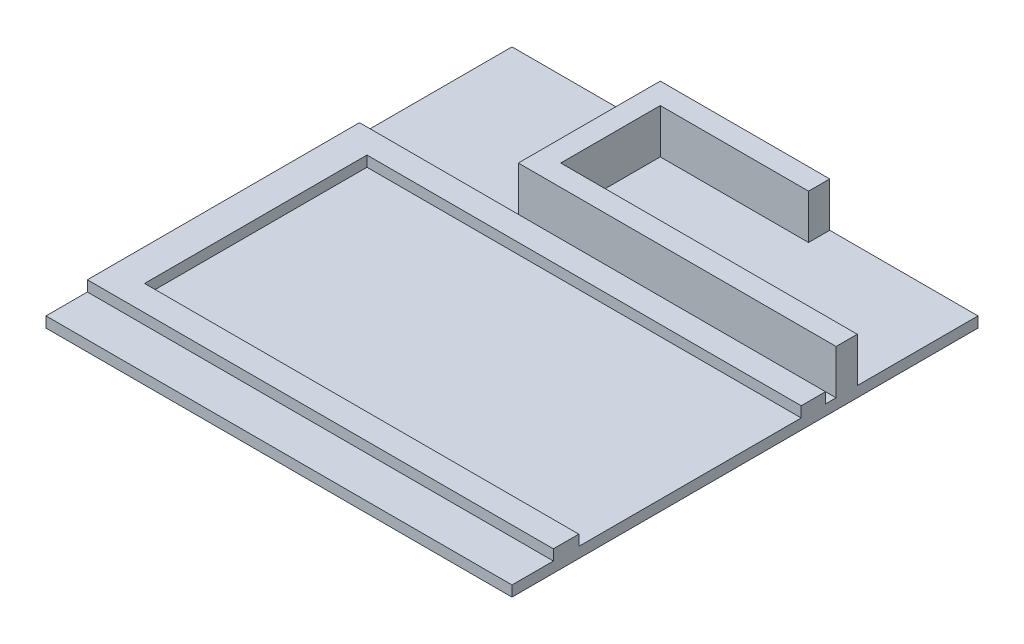
ISO-10303-21;
HEADER;
FILE_DESCRIPTION(('STEP AP214'),'2;1');
FILE_NAME('part.step','',(''),(''),'','','');
FILE_SCHEMA(('AUTOMOTIVE_DESIGN { 1 0 10303 214 1 1 1 1 }'));
ENDSEC;
DATA;
#1=APPLICATION_CONTEXT('core data for automotive mechanical design processes');
#2=APPLICATION_PROTOCOL_DEFINITION('international standard','automotive_design',2000,#1);
#3=PRODUCT_CONTEXT('',#1,'mechanical');
#4=PRODUCT('Part','Part','',(#3));
#5=PRODUCT_RELATED_PRODUCT_CATEGORY('part','',(#4));
#6=PRODUCT_DEFINITION_FORMATION('','',#4);
#7=PRODUCT_DEFINITION_CONTEXT('part definition',#1,'design');
#8=PRODUCT_DEFINITION('design','',#6,#7);
#9=PRODUCT_DEFINITION_SHAPE('','',#8);
#10=(LENGTH_UNIT() NAMED_UNIT(*) SI_UNIT(.MILLI.,.METRE.));
#11=(NAMED_UNIT(*) PLANE_ANGLE_UNIT() SI_UNIT($,.RADIAN.));
#12=(NAMED_UNIT(*) SI_UNIT($,.STERADIAN.) SOLID_ANGLE_UNIT());
#13=UNCERTAINTY_MEASURE_WITH_UNIT(LENGTH_MEASURE(1.E-05),#10,'distance_accuracy_value','');
#14=(GEOMETRIC_REPRESENTATION_CONTEXT(3) GLOBAL_UNCERTAINTY_ASSIGNED_CONTEXT((#13)) GLOBAL_UNIT_ASSIGNED_CONTEXT((#10,
#11,#12)) REPRESENTATION_CONTEXT('',''));
#15=CARTESIAN_POINT('',(0.,0.,0.));
#16=DIRECTION('',(0.,0.,1.));
#17=DIRECTION('',(1.,0.,0.));
#18=AXIS2_PLACEMENT_3D('',#15,#16,#17);
#19=CARTESIAN_POINT('',(0.,5.,0.));
#20=DIRECTION('',(0.,-1.,0.));
#21=DIRECTION('',(0.,0.,-1.));
#22=AXIS2_PLACEMENT_3D('',#19,#20,#21);
#23=PLANE('',#22);
#24=DIRECTION('',(1.,0.,0.));
#25=VECTOR('',#24,1.);
#26=CARTESIAN_POINT('',(110.,5.,90.4674962115625));
#27=LINE('',#26,#25);
#28=CARTESIAN_POINT('',(-110.,5.,90.4674962115625));
#29=VERTEX_POINT('',#28);
#30=CARTESIAN_POINT('',(110.,5.,90.4674962115625));
#31=VERTEX_POINT('',#30);
#32=EDGE_CURVE('E346',#29,#31,#27,.T.);
#33=ORIENTED_EDGE('',*,*,#32,.F.);
#34=DIRECTION('',(0.,0.,1.));
#35=VECTOR('',#34,1.);
#36=CARTESIAN_POINT('',(-110.,5.,110.));
#37=LINE('',#36,#35);
#38=CARTESIAN_POINT('',(-110.,5.,110.));
#39=VERTEX_POINT('',#38);
#40=EDGE_CURVE('E201',#29,#39,#37,.T.);
#41=ORIENTED_EDGE('',*,*,#40,.T.);
#42=DIRECTION('',(1.,0.,0.));
#43=VECTOR('',#42,1.);
#44=CARTESIAN_POINT('',(-110.,5.,110.));
#45=LINE('',#44,#43);
#46=CARTESIAN_POINT('',(110.,5.,110.));
#47=VERTEX_POINT('',#46);
#48=EDGE_CURVE('E305',#39,#47,#45,.T.);
#49=ORIENTED_EDGE('',*,*,#48,.T.);
#50=DIRECTION('',(0.,0.,-1.));
#51=VECTOR('',#50,1.);
#52=CARTESIAN_POINT('',(110.,5.,110.));
#53=LINE('',#52,#51);
#54=EDGE_CURVE('E292',#47,#31,#53,.T.);
#55=ORIENTED_EDGE('',*,*,#54,.T.);
#56=EDGE_LOOP('',(#33,#41,#49,#55));
#57=FACE_BOUND('',#56,.T.);
#58=ADVANCED_FACE('F39',(#57),#23,.F.);
#59=DIRECTION('',(-1.,0.,0.));
#60=VECTOR('',#59,1.);
#61=CARTESIAN_POINT('',(-94.9999999999999,5.,78.4674962115625));
#62=LINE('',#61,#60);
#63=CARTESIAN_POINT('',(110.,5.,78.4674962115625));
#64=VERTEX_POINT('',#63);
#65=CARTESIAN_POINT('',(-94.9999999999999,5.,78.4674962115625));
#66=VERTEX_POINT('',#65);
#67=EDGE_CURVE('E348',#64,#66,#62,.T.);
#68=ORIENTED_EDGE('',*,*,#67,.F.);
#69=CARTESIAN_POINT('',(110.,5.,-26.5325037884376));
#70=VERTEX_POINT('',#69);
#71=EDGE_CURVE('E296',#64,#70,#53,.T.);
#72=ORIENTED_EDGE('',*,*,#71,.T.);
#73=DIRECTION('',(1.,0.,0.));
#74=VECTOR('',#73,1.);
#75=CARTESIAN_POINT('',(110.,5.,-26.5325037884376));
#76=LINE('',#75,#74);
#77=CARTESIAN_POINT('',(-95.,5.,-26.5325037884375));
#78=VERTEX_POINT('',#77);
#79=EDGE_CURVE('E60',#78,#70,#76,.T.);
#80=ORIENTED_EDGE('',*,*,#79,.F.);
#81=DIRECTION('',(0.,0.,-1.));
#82=VECTOR('',#81,1.);
#83=CARTESIAN_POINT('',(-95.,5.,-26.5325037884375));
#84=LINE('',#83,#82);
#85=EDGE_CURVE('E55',#66,#78,#84,.T.);
#86=ORIENTED_EDGE('',*,*,#85,.F.);
#87=EDGE_LOOP('',(#68,#72,#80,#86));
#88=FACE_BOUND('',#87,.T.);
#89=ADVANCED_FACE('F461',(#88),#23,.F.);
#90=DIRECTION('',(-1.,0.,0.));
#91=VECTOR('',#90,1.);
#92=CARTESIAN_POINT('',(-110.,5.,-38.));
#93=LINE('',#92,#91);
#94=CARTESIAN_POINT('',(110.,5.,-38.));
#95=VERTEX_POINT('',#94);
#96=CARTESIAN_POINT('',(-110.,5.,-38.));
#97=VERTEX_POINT('',#96);
#98=EDGE_CURVE('E197',#95,#97,#93,.T.);
#99=ORIENTED_EDGE('',*,*,#98,.F.);
#100=CARTESIAN_POINT('',(110.,5.,-43.));
#101=VERTEX_POINT('',#100);
#102=EDGE_CURVE('E297',#95,#101,#53,.T.);
#103=ORIENTED_EDGE('',*,*,#102,.T.);
#104=DIRECTION('',(1.,0.,0.));
#105=VECTOR('',#104,1.);
#106=CARTESIAN_POINT('',(110.,5.,-43.));
#107=LINE('',#106,#105);
#108=CARTESIAN_POINT('',(-40.,5.,-43.));
#109=VERTEX_POINT('',#108);
#110=EDGE_CURVE('E209',#109,#101,#107,.T.);
#111=ORIENTED_EDGE('',*,*,#110,.F.);
#112=DIRECTION('',(0.,0.,1.));
#113=VECTOR('',#112,1.);
#114=CARTESIAN_POINT('',(-40.,5.,-43.));
#115=LINE('',#114,#113);
#116=CARTESIAN_POINT('',(-40.,5.,-110.));
#117=VERTEX_POINT('',#116);
#118=EDGE_CURVE('E204',#117,#109,#115,.T.);
#119=ORIENTED_EDGE('',*,*,#118,.F.);
#120=DIRECTION('',(-1.,0.,0.));
#121=VECTOR('',#120,1.);
#122=CARTESIAN_POINT('',(-110.,5.,-110.));
#123=LINE('',#122,#121);
#124=CARTESIAN_POINT('',(-110.,5.,-110.));
#125=VERTEX_POINT('',#124);
#126=EDGE_CURVE('E295',#117,#125,#123,.T.);
#127=ORIENTED_EDGE('',*,*,#126,.T.);
#128=EDGE_CURVE('E302',#125,#97,#37,.T.);
#129=ORIENTED_EDGE('',*,*,#128,.T.);
#130=EDGE_LOOP('',(#99,#103,#111,#119,#127,#129));
#131=FACE_BOUND('',#130,.T.);
#132=ADVANCED_FACE('F428',(#131),#23,.F.);
#133=DIRECTION('',(0.,0.,-1.));
#134=VECTOR('',#133,1.);
#135=CARTESIAN_POINT('',(40.,5.,-110.));
#136=LINE('',#135,#134);
#137=CARTESIAN_POINT('',(40.,5.,-100.));
#138=VERTEX_POINT('',#137);
#139=CARTESIAN_POINT('',(40.,5.,-110.));
#140=VERTEX_POINT('',#139);
#141=EDGE_CURVE('E220',#138,#140,#136,.T.);
#142=ORIENTED_EDGE('',*,*,#141,.F.);
#143=DIRECTION('',(1.,0.,0.));
#144=VECTOR('',#143,1.);
#145=CARTESIAN_POINT('',(40.,5.,-100.));
#146=LINE('',#145,#144);
#147=CARTESIAN_POINT('',(-30.,5.,-100.));
#148=VERTEX_POINT('',#147);
#149=EDGE_CURVE('E253',#148,#138,#146,.T.);
#150=ORIENTED_EDGE('',*,*,#149,.F.);
#151=DIRECTION('',(0.,0.,-1.));
#152=VECTOR('',#151,1.);
#153=CARTESIAN_POINT('',(-30.,5.,-100.));
#154=LINE('',#153,#152);
#155=CARTESIAN_POINT('',(-30.,5.,-53.));
#156=VERTEX_POINT('',#155);
#157=EDGE_CURVE('E249',#156,#148,#154,.T.);
#158=ORIENTED_EDGE('',*,*,#157,.F.);
#159=DIRECTION('',(-1.,0.,0.));
#160=VECTOR('',#159,1.);
#161=CARTESIAN_POINT('',(-30.,5.,-53.));
#162=LINE('',#161,#160);
#163=CARTESIAN_POINT('',(110.,5.,-53.));
#164=VERTEX_POINT('',#163);
#165=EDGE_CURVE('E245',#164,#156,#162,.T.);
#166=ORIENTED_EDGE('',*,*,#165,.F.);
#167=CARTESIAN_POINT('',(110.,5.,-110.));
#168=VERTEX_POINT('',#167);
#169=EDGE_CURVE('E298',#164,#168,#53,.T.);
#170=ORIENTED_EDGE('',*,*,#169,.T.);
#171=EDGE_CURVE('E299',#168,#140,#123,.T.);
#172=ORIENTED_EDGE('',*,*,#171,.T.);
#173=EDGE_LOOP('',(#142,#150,#158,#166,#170,#172));
#174=FACE_BOUND('',#173,.T.);
#175=ADVANCED_FACE('F397',(#174),#23,.F.);
#176=CARTESIAN_POINT('',(110.,5.,110.));
#177=DIRECTION('',(-1.,0.,0.));
#178=DIRECTION('',(0.,0.,1.));
#179=AXIS2_PLACEMENT_3D('',#176,#177,#178);
#180=PLANE('',#179);
#181=DIRECTION('',(0.,0.,-1.));
#182=VECTOR('',#181,1.);
#183=CARTESIAN_POINT('',(110.,0.,110.));
#184=LINE('',#183,#182);
#185=CARTESIAN_POINT('',(110.,0.,110.));
#186=VERTEX_POINT('',#185);
#187=CARTESIAN_POINT('',(110.,0.,-110.));
#188=VERTEX_POINT('',#187);
#189=EDGE_CURVE('E291',#186,#188,#184,.T.);
#190=ORIENTED_EDGE('',*,*,#189,.T.);
#191=DIRECTION('',(0.,-1.,0.));
#192=VECTOR('',#191,1.);
#193=CARTESIAN_POINT('',(110.,5.,-110.));
#194=LINE('',#193,#192);
#195=EDGE_CURVE('E11',#168,#188,#194,.T.);
#196=ORIENTED_EDGE('',*,*,#195,.F.);
#197=ORIENTED_EDGE('',*,*,#169,.F.);
#198=DIRECTION('',(0.,-1.,0.));
#199=VECTOR('',#198,1.);
#200=CARTESIAN_POINT('',(110.,26.,-53.));
#201=LINE('',#200,#199);
#202=CARTESIAN_POINT('',(110.,26.,-53.));
#203=VERTEX_POINT('',#202);
#204=EDGE_CURVE('E279',#203,#164,#201,.T.);
#205=ORIENTED_EDGE('',*,*,#204,.F.);
#206=DIRECTION('',(0.,0.,-1.));
#207=VECTOR('',#206,1.);
#208=CARTESIAN_POINT('',(110.,26.,-53.));
#209=LINE('',#208,#207);
#210=CARTESIAN_POINT('',(110.,26.,-43.));
#211=VERTEX_POINT('',#210);
#212=EDGE_CURVE('E223',#211,#203,#209,.T.);
#213=ORIENTED_EDGE('',*,*,#212,.F.);
#214=DIRECTION('',(0.,-1.,0.));
#215=VECTOR('',#214,1.);
#216=CARTESIAN_POINT('',(110.,26.,-43.));
#217=LINE('',#216,#215);
#218=EDGE_CURVE('E283',#211,#101,#217,.T.);
#219=ORIENTED_EDGE('',*,*,#218,.T.);
#220=ORIENTED_EDGE('',*,*,#102,.F.);
#221=DIRECTION('',(0.,-1.,0.));
#222=VECTOR('',#221,1.);
#223=CARTESIAN_POINT('',(110.,10.,-38.));
#224=LINE('',#223,#222);
#225=CARTESIAN_POINT('',(110.,10.,-38.));
#226=VERTEX_POINT('',#225);
#227=EDGE_CURVE('E365',#226,#95,#224,.T.);
#228=ORIENTED_EDGE('',*,*,#227,.F.);
#229=DIRECTION('',(0.,0.,-1.));
#230=VECTOR('',#229,1.);
#231=CARTESIAN_POINT('',(110.,10.,-38.));
#232=LINE('',#231,#230);
#233=CARTESIAN_POINT('',(110.,10.,-26.5325037884376));
#234=VERTEX_POINT('',#233);
#235=EDGE_CURVE('E433',#234,#226,#232,.T.);
#236=ORIENTED_EDGE('',*,*,#235,.F.);
#237=DIRECTION('',(0.,-1.,0.));
#238=VECTOR('',#237,1.);
#239=CARTESIAN_POINT('',(110.,10.,-26.5325037884376));
#240=LINE('',#239,#238);
#241=EDGE_CURVE('E369',#234,#70,#240,.T.);
#242=ORIENTED_EDGE('',*,*,#241,.T.);
#243=ORIENTED_EDGE('',*,*,#71,.F.);
#244=DIRECTION('',(0.,-1.,0.));
#245=VECTOR('',#244,1.);
#246=CARTESIAN_POINT('',(110.,10.,78.4674962115625));
#247=LINE('',#246,#245);
#248=CARTESIAN_POINT('',(110.,10.,78.4674962115625));
#249=VERTEX_POINT('',#248);
#250=EDGE_CURVE('E211',#249,#64,#247,.T.);
#251=ORIENTED_EDGE('',*,*,#250,.F.);
#252=DIRECTION('',(0.,0.,-1.));
#253=VECTOR('',#252,1.);
#254=CARTESIAN_POINT('',(110.,10.,78.4674962115625));
#255=LINE('',#254,#253);
#256=CARTESIAN_POINT('',(110.,10.,90.4674962115625));
#257=VERTEX_POINT('',#256);
#258=EDGE_CURVE('E186',#257,#249,#255,.T.);
#259=ORIENTED_EDGE('',*,*,#258,.F.);
#260=DIRECTION('',(0.,-1.,0.));
#261=VECTOR('',#260,1.);
#262=CARTESIAN_POINT('',(110.,10.,90.4674962115625));
#263=LINE('',#262,#261);
#264=EDGE_CURVE('E182',#257,#31,#263,.T.);
#265=ORIENTED_EDGE('',*,*,#264,.T.);
#266=ORIENTED_EDGE('',*,*,#54,.F.);
#267=DIRECTION('',(0.,-1.,0.));
#268=VECTOR('',#267,1.);
#269=CARTESIAN_POINT('',(110.,5.,110.));
#270=LINE('',#269,#268);
#271=EDGE_CURVE('E308',#47,#186,#270,.T.);
#272=ORIENTED_EDGE('',*,*,#271,.T.);
#273=EDGE_LOOP('',(#190,#196,#197,#205,#213,#219,#220,#228,#236,#242,#243,#251,#259,#265,#266,#272));
#274=FACE_BOUND('',#273,.T.);
#275=ADVANCED_FACE('F41',(#274),#180,.F.);
#276=CARTESIAN_POINT('',(-110.,5.,-110.));
#277=DIRECTION('',(0.,0.,1.));
#278=DIRECTION('',(1.,0.,0.));
#279=AXIS2_PLACEMENT_3D('',#276,#277,#278);
#280=PLANE('',#279);
#281=DIRECTION('',(-1.,0.,0.));
#282=VECTOR('',#281,1.);
#283=CARTESIAN_POINT('',(-110.,0.,-110.));
#284=LINE('',#283,#282);
#285=CARTESIAN_POINT('',(-110.,0.,-110.));
#286=VERTEX_POINT('',#285);
#287=EDGE_CURVE('E312',#188,#286,#284,.T.);
#288=ORIENTED_EDGE('',*,*,#287,.T.);
#289=DIRECTION('',(0.,-1.,0.));
#290=VECTOR('',#289,1.);
#291=CARTESIAN_POINT('',(-110.,5.,-110.));
#292=LINE('',#291,#290);
#293=EDGE_CURVE('E48',#125,#286,#292,.T.);
#294=ORIENTED_EDGE('',*,*,#293,.F.);
#295=ORIENTED_EDGE('',*,*,#126,.F.);
#296=DIRECTION('',(0.,-1.,0.));
#297=VECTOR('',#296,1.);
#298=CARTESIAN_POINT('',(-40.,26.,-110.));
#299=LINE('',#298,#297);
#300=CARTESIAN_POINT('',(-40.,26.,-110.));
#301=VERTEX_POINT('',#300);
#302=EDGE_CURVE('E240',#301,#117,#299,.T.);
#303=ORIENTED_EDGE('',*,*,#302,.F.);
#304=DIRECTION('',(-1.,0.,0.));
#305=VECTOR('',#304,1.);
#306=CARTESIAN_POINT('',(-40.,26.,-110.));
#307=LINE('',#306,#305);
#308=CARTESIAN_POINT('',(40.,26.,-110.));
#309=VERTEX_POINT('',#308);
#310=EDGE_CURVE('E238',#309,#301,#307,.T.);
#311=ORIENTED_EDGE('',*,*,#310,.F.);
#312=DIRECTION('',(0.,-1.,0.));
#313=VECTOR('',#312,1.);
#314=CARTESIAN_POINT('',(40.,26.,-110.));
#315=LINE('',#314,#313);
#316=EDGE_CURVE('E263',#309,#140,#315,.T.);
#317=ORIENTED_EDGE('',*,*,#316,.T.);
#318=ORIENTED_EDGE('',*,*,#171,.F.);
#319=ORIENTED_EDGE('',*,*,#195,.T.);
#320=EDGE_LOOP('',(#288,#294,#295,#303,#311,#317,#318,#319));
#321=FACE_BOUND('',#320,.T.);
#322=ADVANCED_FACE('F399',(#321),#280,.F.);
#323=CARTESIAN_POINT('',(-110.,5.,110.));
#324=DIRECTION('',(1.,0.,0.));
#325=DIRECTION('',(0.,0.,-1.));
#326=AXIS2_PLACEMENT_3D('',#323,#324,#325);
#327=PLANE('',#326);
#328=DIRECTION('',(0.,0.,1.));
#329=VECTOR('',#328,1.);
#330=CARTESIAN_POINT('',(-110.,0.,110.));
#331=LINE('',#330,#329);
#332=CARTESIAN_POINT('',(-110.,0.,110.));
#333=VERTEX_POINT('',#332);
#334=EDGE_CURVE('E315',#286,#333,#331,.T.);
#335=ORIENTED_EDGE('',*,*,#334,.T.);
#336=DIRECTION('',(0.,-1.,0.));
#337=VECTOR('',#336,1.);
#338=CARTESIAN_POINT('',(-110.,5.,110.));
#339=LINE('',#338,#337);
#340=EDGE_CURVE('E324',#39,#333,#339,.T.);
#341=ORIENTED_EDGE('',*,*,#340,.F.);
#342=ORIENTED_EDGE('',*,*,#40,.F.);
#343=DIRECTION('',(0.,-1.,0.));
#344=VECTOR('',#343,1.);
#345=CARTESIAN_POINT('',(-110.,10.,90.4674962115625));
#346=LINE('',#345,#344);
#347=CARTESIAN_POINT('',(-110.,10.,90.4674962115625));
#348=VERTEX_POINT('',#347);
#349=EDGE_CURVE('E180',#348,#29,#346,.T.);
#350=ORIENTED_EDGE('',*,*,#349,.F.);
#351=DIRECTION('',(0.,0.,1.));
#352=VECTOR('',#351,1.);
#353=CARTESIAN_POINT('',(-110.,10.,90.4674962115625));
#354=LINE('',#353,#352);
#355=CARTESIAN_POINT('',(-110.,10.,-38.));
#356=VERTEX_POINT('',#355);
#357=EDGE_CURVE('E187',#356,#348,#354,.T.);
#358=ORIENTED_EDGE('',*,*,#357,.F.);
#359=DIRECTION('',(0.,-1.,0.));
#360=VECTOR('',#359,1.);
#361=CARTESIAN_POINT('',(-110.,10.,-38.));
#362=LINE('',#361,#360);
#363=EDGE_CURVE('E362',#356,#97,#362,.T.);
#364=ORIENTED_EDGE('',*,*,#363,.T.);
#365=ORIENTED_EDGE('',*,*,#128,.F.);
#366=ORIENTED_EDGE('',*,*,#293,.T.);
#367=EDGE_LOOP('',(#335,#341,#342,#350,#358,#364,#365,#366));
#368=FACE_BOUND('',#367,.T.);
#369=ADVANCED_FACE('F199',(#368),#327,.F.);
#370=CARTESIAN_POINT('',(-110.,5.,110.));
#371=DIRECTION('',(0.,0.,-1.));
#372=DIRECTION('',(-1.,0.,0.));
#373=AXIS2_PLACEMENT_3D('',#370,#371,#372);
#374=PLANE('',#373);
#375=DIRECTION('',(1.,0.,0.));
#376=VECTOR('',#375,1.);
#377=CARTESIAN_POINT('',(-110.,0.,110.));
#378=LINE('',#377,#376);
#379=EDGE_CURVE('E318',#333,#186,#378,.T.);
#380=ORIENTED_EDGE('',*,*,#379,.T.);
#381=ORIENTED_EDGE('',*,*,#271,.F.);
#382=ORIENTED_EDGE('',*,*,#48,.F.);
#383=ORIENTED_EDGE('',*,*,#340,.T.);
#384=EDGE_LOOP('',(#380,#381,#382,#383));
#385=FACE_BOUND('',#384,.T.);
#386=ADVANCED_FACE('F340',(#385),#374,.F.);
#387=CARTESIAN_POINT('',(0.,0.,0.));
#388=DIRECTION('',(0.,-1.,0.));
#389=DIRECTION('',(0.,0.,-1.));
#390=AXIS2_PLACEMENT_3D('',#387,#388,#389);
#391=PLANE('',#390);
#392=ORIENTED_EDGE('',*,*,#189,.F.);
#393=ORIENTED_EDGE('',*,*,#379,.F.);
#394=ORIENTED_EDGE('',*,*,#334,.F.);
#395=ORIENTED_EDGE('',*,*,#287,.F.);
#396=EDGE_LOOP('',(#392,#393,#394,#395));
#397=FACE_BOUND('',#396,.T.);
#398=ADVANCED_FACE('F337',(#397),#391,.T.);
#399=CARTESIAN_POINT('',(-40.,26.,-43.));
#400=DIRECTION('',(1.,0.,0.));
#401=DIRECTION('',(0.,0.,-1.));
#402=AXIS2_PLACEMENT_3D('',#399,#400,#401);
#403=PLANE('',#402);
#404=ORIENTED_EDGE('',*,*,#118,.T.);
#405=DIRECTION('',(0.,-1.,0.));
#406=VECTOR('',#405,1.);
#407=CARTESIAN_POINT('',(-40.,26.,-43.));
#408=LINE('',#407,#406);
#409=CARTESIAN_POINT('',(-40.,26.,-43.));
#410=VERTEX_POINT('',#409);
#411=EDGE_CURVE('E287',#410,#109,#408,.T.);
#412=ORIENTED_EDGE('',*,*,#411,.F.);
#413=DIRECTION('',(0.,0.,1.));
#414=VECTOR('',#413,1.);
#415=CARTESIAN_POINT('',(-40.,26.,-43.));
#416=LINE('',#415,#414);
#417=EDGE_CURVE('E215',#301,#410,#416,.T.);
#418=ORIENTED_EDGE('',*,*,#417,.F.);
#419=ORIENTED_EDGE('',*,*,#302,.T.);
#420=EDGE_LOOP('',(#404,#412,#418,#419));
#421=FACE_BOUND('',#420,.T.);
#422=ADVANCED_FACE('F535',(#421),#403,.F.);
#423=CARTESIAN_POINT('',(110.,26.,-43.));
#424=DIRECTION('',(0.,0.,-1.));
#425=DIRECTION('',(-1.,0.,0.));
#426=AXIS2_PLACEMENT_3D('',#423,#424,#425);
#427=PLANE('',#426);
#428=ORIENTED_EDGE('',*,*,#110,.T.);
#429=ORIENTED_EDGE('',*,*,#218,.F.);
#430=DIRECTION('',(1.,0.,0.));
#431=VECTOR('',#430,1.);
#432=CARTESIAN_POINT('',(110.,26.,-43.));
#433=LINE('',#432,#431);
#434=EDGE_CURVE('E219',#410,#211,#433,.T.);
#435=ORIENTED_EDGE('',*,*,#434,.F.);
#436=ORIENTED_EDGE('',*,*,#411,.T.);
#437=EDGE_LOOP('',(#428,#429,#435,#436));
#438=FACE_BOUND('',#437,.T.);
#439=ADVANCED_FACE('F426',(#438),#427,.F.);
#440=CARTESIAN_POINT('',(-30.,26.,-53.));
#441=DIRECTION('',(0.,0.,1.));
#442=DIRECTION('',(1.,0.,0.));
#443=AXIS2_PLACEMENT_3D('',#440,#441,#442);
#444=PLANE('',#443);
#445=ORIENTED_EDGE('',*,*,#165,.T.);
#446=DIRECTION('',(0.,-1.,0.));
#447=VECTOR('',#446,1.);
#448=CARTESIAN_POINT('',(-30.,26.,-53.));
#449=LINE('',#448,#447);
#450=CARTESIAN_POINT('',(-30.,26.,-53.));
#451=VERTEX_POINT('',#450);
#452=EDGE_CURVE('E275',#451,#156,#449,.T.);
#453=ORIENTED_EDGE('',*,*,#452,.F.);
#454=DIRECTION('',(-1.,0.,0.));
#455=VECTOR('',#454,1.);
#456=CARTESIAN_POINT('',(-30.,26.,-53.));
#457=LINE('',#456,#455);
#458=EDGE_CURVE('E226',#203,#451,#457,.T.);
#459=ORIENTED_EDGE('',*,*,#458,.F.);
#460=ORIENTED_EDGE('',*,*,#204,.T.);
#461=EDGE_LOOP('',(#445,#453,#459,#460));
#462=FACE_BOUND('',#461,.T.);
#463=ADVANCED_FACE('F416',(#462),#444,.F.);
#464=CARTESIAN_POINT('',(-30.,26.,-100.));
#465=DIRECTION('',(-1.,0.,0.));
#466=DIRECTION('',(0.,0.,1.));
#467=AXIS2_PLACEMENT_3D('',#464,#465,#466);
#468=PLANE('',#467);
#469=ORIENTED_EDGE('',*,*,#157,.T.);
#470=DIRECTION('',(0.,-1.,0.));
#471=VECTOR('',#470,1.);
#472=CARTESIAN_POINT('',(-30.,26.,-100.));
#473=LINE('',#472,#471);
#474=CARTESIAN_POINT('',(-30.,26.,-100.));
#475=VERTEX_POINT('',#474);
#476=EDGE_CURVE('E271',#475,#148,#473,.T.);
#477=ORIENTED_EDGE('',*,*,#476,.F.);
#478=DIRECTION('',(0.,0.,-1.));
#479=VECTOR('',#478,1.);
#480=CARTESIAN_POINT('',(-30.,26.,-100.));
#481=LINE('',#480,#479);
#482=EDGE_CURVE('E229',#451,#475,#481,.T.);
#483=ORIENTED_EDGE('',*,*,#482,.F.);
#484=ORIENTED_EDGE('',*,*,#452,.T.);
#485=EDGE_LOOP('',(#469,#477,#483,#484));
#486=FACE_BOUND('',#485,.T.);
#487=ADVANCED_FACE('F413',(#486),#468,.F.);
#488=CARTESIAN_POINT('',(40.,26.,-100.));
#489=DIRECTION('',(0.,0.,-1.));
#490=DIRECTION('',(-1.,0.,0.));
#491=AXIS2_PLACEMENT_3D('',#488,#489,#490);
#492=PLANE('',#491);
#493=ORIENTED_EDGE('',*,*,#149,.T.);
#494=DIRECTION('',(0.,-1.,0.));
#495=VECTOR('',#494,1.);
#496=CARTESIAN_POINT('',(40.,26.,-100.));
#497=LINE('',#496,#495);
#498=CARTESIAN_POINT('',(40.,26.,-100.));
#499=VERTEX_POINT('',#498);
#500=EDGE_CURVE('E267',#499,#138,#497,.T.);
#501=ORIENTED_EDGE('',*,*,#500,.F.);
#502=DIRECTION('',(1.,0.,0.));
#503=VECTOR('',#502,1.);
#504=CARTESIAN_POINT('',(40.,26.,-100.));
#505=LINE('',#504,#503);
#506=EDGE_CURVE('E232',#475,#499,#505,.T.);
#507=ORIENTED_EDGE('',*,*,#506,.F.);
#508=ORIENTED_EDGE('',*,*,#476,.T.);
#509=EDGE_LOOP('',(#493,#501,#507,#508));
#510=FACE_BOUND('',#509,.T.);
#511=ADVANCED_FACE('F408',(#510),#492,.F.);
#512=CARTESIAN_POINT('',(40.,26.,-110.));
#513=DIRECTION('',(-1.,0.,0.));
#514=DIRECTION('',(0.,0.,1.));
#515=AXIS2_PLACEMENT_3D('',#512,#513,#514);
#516=PLANE('',#515);
#517=ORIENTED_EDGE('',*,*,#141,.T.);
#518=ORIENTED_EDGE('',*,*,#316,.F.);
#519=DIRECTION('',(0.,0.,-1.));
#520=VECTOR('',#519,1.);
#521=CARTESIAN_POINT('',(40.,26.,-110.));
#522=LINE('',#521,#520);
#523=EDGE_CURVE('E235',#499,#309,#522,.T.);
#524=ORIENTED_EDGE('',*,*,#523,.F.);
#525=ORIENTED_EDGE('',*,*,#500,.T.);
#526=EDGE_LOOP('',(#517,#518,#524,#525));
#527=FACE_BOUND('',#526,.T.);
#528=ADVANCED_FACE('F405',(#527),#516,.F.);
#529=CARTESIAN_POINT('',(0.,26.,0.));
#530=DIRECTION('',(0.,-1.,0.));
#531=DIRECTION('',(0.,0.,-1.));
#532=AXIS2_PLACEMENT_3D('',#529,#530,#531);
#533=PLANE('',#532);
#534=ORIENTED_EDGE('',*,*,#417,.T.);
#535=ORIENTED_EDGE('',*,*,#434,.T.);
#536=ORIENTED_EDGE('',*,*,#212,.T.);
#537=ORIENTED_EDGE('',*,*,#458,.T.);
#538=ORIENTED_EDGE('',*,*,#482,.T.);
#539=ORIENTED_EDGE('',*,*,#506,.T.);
#540=ORIENTED_EDGE('',*,*,#523,.T.);
#541=ORIENTED_EDGE('',*,*,#310,.T.);
#542=EDGE_LOOP('',(#534,#535,#536,#537,#538,#539,#540,#541));
#543=FACE_BOUND('',#542,.T.);
#544=ADVANCED_FACE('F422',(#543),#533,.F.);
#545=CARTESIAN_POINT('',(110.,10.,90.4674962115625));
#546=DIRECTION('',(0.,0.,-1.));
#547=DIRECTION('',(-1.,0.,0.));
#548=AXIS2_PLACEMENT_3D('',#545,#546,#547);
#549=PLANE('',#548);
#550=ORIENTED_EDGE('',*,*,#32,.T.);
#551=ORIENTED_EDGE('',*,*,#264,.F.);
#552=DIRECTION('',(1.,0.,0.));
#553=VECTOR('',#552,1.);
#554=CARTESIAN_POINT('',(110.,10.,90.4674962115625));
#555=LINE('',#554,#553);
#556=EDGE_CURVE('E175',#348,#257,#555,.T.);
#557=ORIENTED_EDGE('',*,*,#556,.F.);
#558=ORIENTED_EDGE('',*,*,#349,.T.);
#559=EDGE_LOOP('',(#550,#551,#557,#558));
#560=FACE_BOUND('',#559,.T.);
#561=ADVANCED_FACE('F178',(#560),#549,.F.);
#562=CARTESIAN_POINT('',(-94.9999999999999,10.,78.4674962115625));
#563=DIRECTION('',(0.,0.,1.));
#564=DIRECTION('',(1.,0.,0.));
#565=AXIS2_PLACEMENT_3D('',#562,#563,#564);
#566=PLANE('',#565);
#567=ORIENTED_EDGE('',*,*,#67,.T.);
#568=DIRECTION('',(0.,-1.,0.));
#569=VECTOR('',#568,1.);
#570=CARTESIAN_POINT('',(-94.9999999999999,10.,78.4674962115625));
#571=LINE('',#570,#569);
#572=CARTESIAN_POINT('',(-94.9999999999999,10.,78.4674962115625));
#573=VERTEX_POINT('',#572);
#574=EDGE_CURVE('E377',#573,#66,#571,.T.);
#575=ORIENTED_EDGE('',*,*,#574,.F.);
#576=DIRECTION('',(-1.,0.,0.));
#577=VECTOR('',#576,1.);
#578=CARTESIAN_POINT('',(-94.9999999999999,10.,78.4674962115625));
#579=LINE('',#578,#577);
#580=EDGE_CURVE('E387',#249,#573,#579,.T.);
#581=ORIENTED_EDGE('',*,*,#580,.F.);
#582=ORIENTED_EDGE('',*,*,#250,.T.);
#583=EDGE_LOOP('',(#567,#575,#581,#582));
#584=FACE_BOUND('',#583,.T.);
#585=ADVANCED_FACE('F385',(#584),#566,.F.);
#586=CARTESIAN_POINT('',(-95.,10.,-26.5325037884375));
#587=DIRECTION('',(-1.,0.,0.));
#588=DIRECTION('',(0.,0.,1.));
#589=AXIS2_PLACEMENT_3D('',#586,#587,#588);
#590=PLANE('',#589);
#591=ORIENTED_EDGE('',*,*,#85,.T.);
#592=DIRECTION('',(0.,-1.,0.));
#593=VECTOR('',#592,1.);
#594=CARTESIAN_POINT('',(-95.,10.,-26.5325037884375));
#595=LINE('',#594,#593);
#596=CARTESIAN_POINT('',(-95.,10.,-26.5325037884375));
#597=VERTEX_POINT('',#596);
#598=EDGE_CURVE('E373',#597,#78,#595,.T.);
#599=ORIENTED_EDGE('',*,*,#598,.F.);
#600=DIRECTION('',(0.,0.,-1.));
#601=VECTOR('',#600,1.);
#602=CARTESIAN_POINT('',(-95.,10.,-26.5325037884375));
#603=LINE('',#602,#601);
#604=EDGE_CURVE('E437',#573,#597,#603,.T.);
#605=ORIENTED_EDGE('',*,*,#604,.F.);
#606=ORIENTED_EDGE('',*,*,#574,.T.);
#607=EDGE_LOOP('',(#591,#599,#605,#606));
#608=FACE_BOUND('',#607,.T.);
#609=ADVANCED_FACE('F448',(#608),#590,.F.);
#610=CARTESIAN_POINT('',(110.,10.,-26.5325037884376));
#611=DIRECTION('',(0.,0.,-1.));
#612=DIRECTION('',(-1.,0.,0.));
#613=AXIS2_PLACEMENT_3D('',#610,#611,#612);
#614=PLANE('',#613);
#615=ORIENTED_EDGE('',*,*,#79,.T.);
#616=ORIENTED_EDGE('',*,*,#241,.F.);
#617=DIRECTION('',(1.,0.,0.));
#618=VECTOR('',#617,1.);
#619=CARTESIAN_POINT('',(110.,10.,-26.5325037884376));
#620=LINE('',#619,#618);
#621=EDGE_CURVE('E435',#597,#234,#620,.T.);
#622=ORIENTED_EDGE('',*,*,#621,.F.);
#623=ORIENTED_EDGE('',*,*,#598,.T.);
#624=EDGE_LOOP('',(#615,#616,#622,#623));
#625=FACE_BOUND('',#624,.T.);
#626=ADVANCED_FACE('F451',(#625),#614,.F.);
#627=CARTESIAN_POINT('',(-110.,10.,-38.));
#628=DIRECTION('',(0.,0.,1.));
#629=DIRECTION('',(1.,0.,0.));
#630=AXIS2_PLACEMENT_3D('',#627,#628,#629);
#631=PLANE('',#630);
#632=ORIENTED_EDGE('',*,*,#98,.T.);
#633=ORIENTED_EDGE('',*,*,#363,.F.);
#634=DIRECTION('',(-1.,0.,0.));
#635=VECTOR('',#634,1.);
#636=CARTESIAN_POINT('',(-110.,10.,-38.));
#637=LINE('',#636,#635);
#638=EDGE_CURVE('E192',#226,#356,#637,.T.);
#639=ORIENTED_EDGE('',*,*,#638,.F.);
#640=ORIENTED_EDGE('',*,*,#227,.T.);
#641=EDGE_LOOP('',(#632,#633,#639,#640));
#642=FACE_BOUND('',#641,.T.);
#643=ADVANCED_FACE('F431',(#642),#631,.F.);
#644=CARTESIAN_POINT('',(0.,10.,0.));
#645=DIRECTION('',(0.,-1.,0.));
#646=DIRECTION('',(0.,0.,-1.));
#647=AXIS2_PLACEMENT_3D('',#644,#645,#646);
#648=PLANE('',#647);
#649=ORIENTED_EDGE('',*,*,#357,.T.);
#650=ORIENTED_EDGE('',*,*,#556,.T.);
#651=ORIENTED_EDGE('',*,*,#258,.T.);
#652=ORIENTED_EDGE('',*,*,#580,.T.);
#653=ORIENTED_EDGE('',*,*,#604,.T.);
#654=ORIENTED_EDGE('',*,*,#621,.T.);
#655=ORIENTED_EDGE('',*,*,#235,.T.);
#656=ORIENTED_EDGE('',*,*,#638,.T.);
#657=EDGE_LOOP('',(#649,#650,#651,#652,#653,#654,#655,#656));
#658=FACE_BOUND('',#657,.T.);
#659=ADVANCED_FACE('F190',(#658),#648,.F.);
#660=CLOSED_SHELL('',(#58,#89,#132,#175,#275,#322,#369,#386,#398,#422,#439,#463,#487,#511,#528,
#544,#561,#585,#609,#626,#643,#659));
#661=MANIFOLD_SOLID_BREP('B2',#660);
#662=ADVANCED_BREP_SHAPE_REPRESENTATION('',(#18,#661),#14);
#663=SHAPE_DEFINITION_REPRESENTATION(#9,#662);
ENDSEC;
END-ISO-10303-21;
